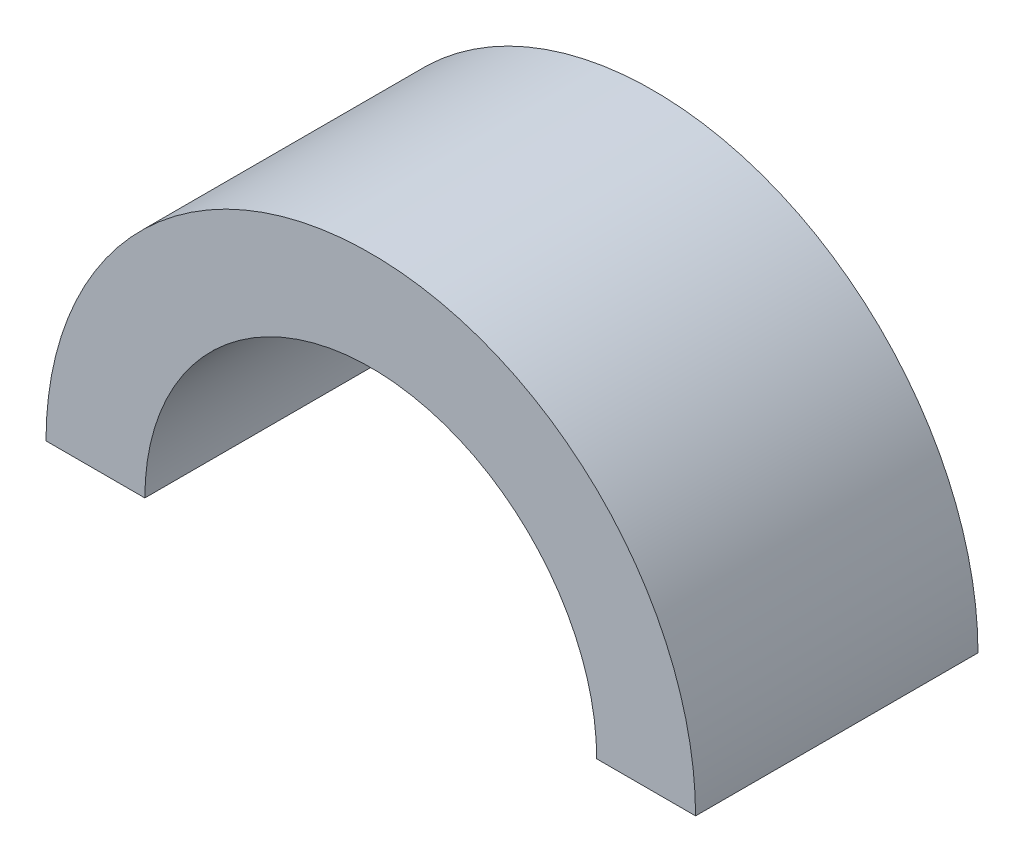
ISO-10303-21;
HEADER;
FILE_DESCRIPTION(('STEP AP214'),'2;1');
FILE_NAME('part.step','',(''),(''),'','','');
FILE_SCHEMA(('AUTOMOTIVE_DESIGN { 1 0 10303 214 1 1 1 1 }'));
ENDSEC;
DATA;
#1=APPLICATION_CONTEXT('core data for automotive mechanical design processes');
#2=APPLICATION_PROTOCOL_DEFINITION('international standard','automotive_design',2000,#1);
#3=PRODUCT_CONTEXT('',#1,'mechanical');
#4=PRODUCT('Part','Part','',(#3));
#5=PRODUCT_RELATED_PRODUCT_CATEGORY('part','',(#4));
#6=PRODUCT_DEFINITION_FORMATION('','',#4);
#7=PRODUCT_DEFINITION_CONTEXT('part definition',#1,'design');
#8=PRODUCT_DEFINITION('design','',#6,#7);
#9=PRODUCT_DEFINITION_SHAPE('','',#8);
#10=(LENGTH_UNIT() NAMED_UNIT(*) SI_UNIT(.MILLI.,.METRE.));
#11=(NAMED_UNIT(*) PLANE_ANGLE_UNIT() SI_UNIT($,.RADIAN.));
#12=(NAMED_UNIT(*) SI_UNIT($,.STERADIAN.) SOLID_ANGLE_UNIT());
#13=UNCERTAINTY_MEASURE_WITH_UNIT(LENGTH_MEASURE(1.E-05),#10,'distance_accuracy_value','');
#14=(GEOMETRIC_REPRESENTATION_CONTEXT(3) GLOBAL_UNCERTAINTY_ASSIGNED_CONTEXT((#13)) GLOBAL_UNIT_ASSIGNED_CONTEXT((#10,
#11,#12)) REPRESENTATION_CONTEXT('',''));
#15=CARTESIAN_POINT('',(0.,0.,0.));
#16=DIRECTION('',(0.,0.,1.));
#17=DIRECTION('',(1.,0.,0.));
#18=AXIS2_PLACEMENT_3D('',#15,#16,#17);
#19=CARTESIAN_POINT('',(23.,23.,20.));
#20=DIRECTION('',(0.,0.,-1.));
#21=DIRECTION('',(-1.,0.,0.));
#22=AXIS2_PLACEMENT_3D('',#19,#20,#21);
#23=CYLINDRICAL_SURFACE('',#22,23.);
#24=CARTESIAN_POINT('',(23.,23.,0.));
#25=DIRECTION('',(0.,0.,1.));
#26=DIRECTION('',(-1.,0.,0.));
#27=AXIS2_PLACEMENT_3D('',#24,#25,#26);
#28=CIRCLE('',#27,23.);
#29=CARTESIAN_POINT('',(46.,23.,0.));
#30=VERTEX_POINT('',#29);
#31=CARTESIAN_POINT('',(0.,23.,0.));
#32=VERTEX_POINT('',#31);
#33=EDGE_CURVE('E108',#30,#32,#28,.T.);
#34=ORIENTED_EDGE('',*,*,#33,.T.);
#35=DIRECTION('',(0.,0.,-1.));
#36=VECTOR('',#35,1.);
#37=CARTESIAN_POINT('',(0.,23.,20.));
#38=LINE('',#37,#36);
#39=CARTESIAN_POINT('',(0.,23.,20.));
#40=VERTEX_POINT('',#39);
#41=EDGE_CURVE('E11',#40,#32,#38,.T.);
#42=ORIENTED_EDGE('',*,*,#41,.F.);
#43=CARTESIAN_POINT('',(23.,23.,20.));
#44=DIRECTION('',(0.,0.,1.));
#45=DIRECTION('',(-1.,0.,0.));
#46=AXIS2_PLACEMENT_3D('',#43,#44,#45);
#47=CIRCLE('',#46,23.);
#48=CARTESIAN_POINT('',(46.,23.,20.));
#49=VERTEX_POINT('',#48);
#50=EDGE_CURVE('E92',#49,#40,#47,.T.);
#51=ORIENTED_EDGE('',*,*,#50,.F.);
#52=DIRECTION('',(0.,0.,-1.));
#53=VECTOR('',#52,1.);
#54=CARTESIAN_POINT('',(46.,23.,20.));
#55=LINE('',#54,#53);
#56=EDGE_CURVE('E105',#49,#30,#55,.T.);
#57=ORIENTED_EDGE('',*,*,#56,.T.);
#58=EDGE_LOOP('',(#34,#42,#51,#57));
#59=FACE_BOUND('',#58,.T.);
#60=ADVANCED_FACE('F43',(#59),#23,.T.);
#61=CARTESIAN_POINT('',(7.,23.,20.));
#62=DIRECTION('',(0.,1.,0.));
#63=DIRECTION('',(0.,0.,1.));
#64=AXIS2_PLACEMENT_3D('',#61,#62,#63);
#65=PLANE('',#64);
#66=DIRECTION('',(1.,0.,0.));
#67=VECTOR('',#66,1.);
#68=CARTESIAN_POINT('',(7.,23.,0.));
#69=LINE('',#68,#67);
#70=CARTESIAN_POINT('',(7.,23.,0.));
#71=VERTEX_POINT('',#70);
#72=EDGE_CURVE('E97',#32,#71,#69,.T.);
#73=ORIENTED_EDGE('',*,*,#72,.T.);
#74=DIRECTION('',(0.,0.,-1.));
#75=VECTOR('',#74,1.);
#76=CARTESIAN_POINT('',(7.,23.,20.));
#77=LINE('',#76,#75);
#78=CARTESIAN_POINT('',(7.,23.,20.));
#79=VERTEX_POINT('',#78);
#80=EDGE_CURVE('E51',#79,#71,#77,.T.);
#81=ORIENTED_EDGE('',*,*,#80,.F.);
#82=DIRECTION('',(1.,0.,0.));
#83=VECTOR('',#82,1.);
#84=CARTESIAN_POINT('',(7.,23.,20.));
#85=LINE('',#84,#83);
#86=EDGE_CURVE('E87',#40,#79,#85,.T.);
#87=ORIENTED_EDGE('',*,*,#86,.F.);
#88=ORIENTED_EDGE('',*,*,#41,.T.);
#89=EDGE_LOOP('',(#73,#81,#87,#88));
#90=FACE_BOUND('',#89,.T.);
#91=ADVANCED_FACE('F100',(#90),#65,.F.);
#92=CARTESIAN_POINT('',(23.,23.,20.));
#93=DIRECTION('',(0.,0.,-1.));
#94=DIRECTION('',(-1.,0.,0.));
#95=AXIS2_PLACEMENT_3D('',#92,#93,#94);
#96=CYLINDRICAL_SURFACE('',#95,16.);
#97=CARTESIAN_POINT('',(23.,23.,0.));
#98=DIRECTION('',(0.,0.,-1.));
#99=DIRECTION('',(1.,0.,0.));
#100=AXIS2_PLACEMENT_3D('',#97,#98,#99);
#101=CIRCLE('',#100,16.);
#102=CARTESIAN_POINT('',(39.,23.,0.));
#103=VERTEX_POINT('',#102);
#104=EDGE_CURVE('E78',#71,#103,#101,.T.);
#105=ORIENTED_EDGE('',*,*,#104,.T.);
#106=DIRECTION('',(0.,0.,-1.));
#107=VECTOR('',#106,1.);
#108=CARTESIAN_POINT('',(39.,23.,20.));
#109=LINE('',#108,#107);
#110=CARTESIAN_POINT('',(39.,23.,20.));
#111=VERTEX_POINT('',#110);
#112=EDGE_CURVE('E98',#111,#103,#109,.T.);
#113=ORIENTED_EDGE('',*,*,#112,.F.);
#114=CARTESIAN_POINT('',(23.,23.,20.));
#115=DIRECTION('',(0.,0.,-1.));
#116=DIRECTION('',(1.,0.,0.));
#117=AXIS2_PLACEMENT_3D('',#114,#115,#116);
#118=CIRCLE('',#117,16.);
#119=EDGE_CURVE('E95',#79,#111,#118,.T.);
#120=ORIENTED_EDGE('',*,*,#119,.F.);
#121=ORIENTED_EDGE('',*,*,#80,.T.);
#122=EDGE_LOOP('',(#105,#113,#120,#121));
#123=FACE_BOUND('',#122,.T.);
#124=ADVANCED_FACE('F99',(#123),#96,.F.);
#125=CARTESIAN_POINT('',(46.,23.,20.));
#126=DIRECTION('',(0.,1.,0.));
#127=DIRECTION('',(0.,0.,1.));
#128=AXIS2_PLACEMENT_3D('',#125,#126,#127);
#129=PLANE('',#128);
#130=DIRECTION('',(1.,0.,0.));
#131=VECTOR('',#130,1.);
#132=CARTESIAN_POINT('',(46.,23.,0.));
#133=LINE('',#132,#131);
#134=EDGE_CURVE('E85',#103,#30,#133,.T.);
#135=ORIENTED_EDGE('',*,*,#134,.T.);
#136=ORIENTED_EDGE('',*,*,#56,.F.);
#137=DIRECTION('',(1.,0.,0.));
#138=VECTOR('',#137,1.);
#139=CARTESIAN_POINT('',(46.,23.,20.));
#140=LINE('',#139,#138);
#141=EDGE_CURVE('E56',#111,#49,#140,.T.);
#142=ORIENTED_EDGE('',*,*,#141,.F.);
#143=ORIENTED_EDGE('',*,*,#112,.T.);
#144=EDGE_LOOP('',(#135,#136,#142,#143));
#145=FACE_BOUND('',#144,.T.);
#146=ADVANCED_FACE('F111',(#145),#129,.F.);
#147=CARTESIAN_POINT('',(23.,23.,20.));
#148=DIRECTION('',(0.,0.,-1.));
#149=DIRECTION('',(-1.,0.,0.));
#150=AXIS2_PLACEMENT_3D('',#147,#148,#149);
#151=PLANE('',#150);
#152=ORIENTED_EDGE('',*,*,#50,.T.);
#153=ORIENTED_EDGE('',*,*,#86,.T.);
#154=ORIENTED_EDGE('',*,*,#119,.T.);
#155=ORIENTED_EDGE('',*,*,#141,.T.);
#156=EDGE_LOOP('',(#152,#153,#154,#155));
#157=FACE_BOUND('',#156,.T.);
#158=ADVANCED_FACE('F89',(#157),#151,.F.);
#159=CARTESIAN_POINT('',(23.,23.,0.));
#160=DIRECTION('',(0.,0.,-1.));
#161=DIRECTION('',(-1.,0.,0.));
#162=AXIS2_PLACEMENT_3D('',#159,#160,#161);
#163=PLANE('',#162);
#164=ORIENTED_EDGE('',*,*,#33,.F.);
#165=ORIENTED_EDGE('',*,*,#134,.F.);
#166=ORIENTED_EDGE('',*,*,#104,.F.);
#167=ORIENTED_EDGE('',*,*,#72,.F.);
#168=EDGE_LOOP('',(#164,#165,#166,#167));
#169=FACE_BOUND('',#168,.T.);
#170=ADVANCED_FACE('F118',(#169),#163,.T.);
#171=CLOSED_SHELL('',(#60,#91,#124,#146,#158,#170));
#172=MANIFOLD_SOLID_BREP('B2',#171);
#173=ADVANCED_BREP_SHAPE_REPRESENTATION('',(#18,#172),#14);
#174=SHAPE_DEFINITION_REPRESENTATION(#9,#173);
ENDSEC;
END-ISO-10303-21;
